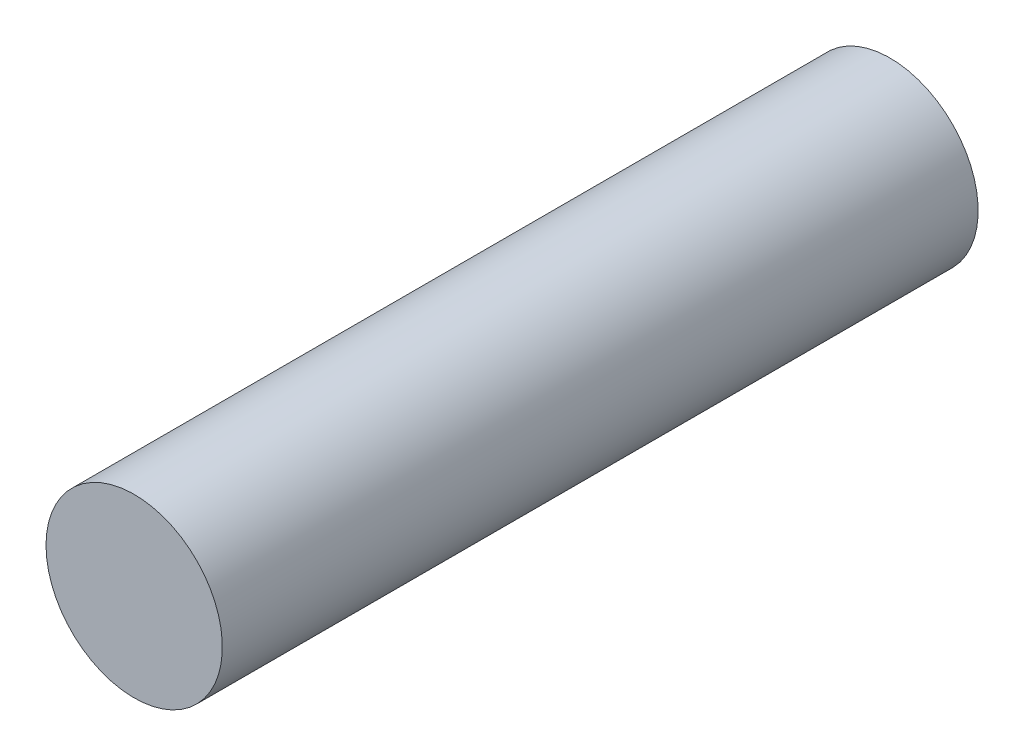
ISO-10303-21;
HEADER;
FILE_DESCRIPTION(('STEP AP214'),'2;1');
FILE_NAME('part.step','',(''),(''),'','','');
FILE_SCHEMA(('AUTOMOTIVE_DESIGN { 1 0 10303 214 1 1 1 1 }'));
ENDSEC;
DATA;
#1=APPLICATION_CONTEXT('core data for automotive mechanical design processes');
#2=APPLICATION_PROTOCOL_DEFINITION('international standard','automotive_design',2000,#1);
#3=PRODUCT_CONTEXT('',#1,'mechanical');
#4=PRODUCT('Part','Part','',(#3));
#5=PRODUCT_RELATED_PRODUCT_CATEGORY('part','',(#4));
#6=PRODUCT_DEFINITION_FORMATION('','',#4);
#7=PRODUCT_DEFINITION_CONTEXT('part definition',#1,'design');
#8=PRODUCT_DEFINITION('design','',#6,#7);
#9=PRODUCT_DEFINITION_SHAPE('','',#8);
#10=(LENGTH_UNIT() NAMED_UNIT(*) SI_UNIT(.MILLI.,.METRE.));
#11=(NAMED_UNIT(*) PLANE_ANGLE_UNIT() SI_UNIT($,.RADIAN.));
#12=(NAMED_UNIT(*) SI_UNIT($,.STERADIAN.) SOLID_ANGLE_UNIT());
#13=UNCERTAINTY_MEASURE_WITH_UNIT(LENGTH_MEASURE(1.E-05),#10,'distance_accuracy_value','');
#14=(GEOMETRIC_REPRESENTATION_CONTEXT(3) GLOBAL_UNCERTAINTY_ASSIGNED_CONTEXT((#13)) GLOBAL_UNIT_ASSIGNED_CONTEXT((#10,
#11,#12)) REPRESENTATION_CONTEXT('',''));
#15=CARTESIAN_POINT('',(0.,0.,0.));
#16=DIRECTION('',(0.,0.,1.));
#17=DIRECTION('',(1.,0.,0.));
#18=AXIS2_PLACEMENT_3D('',#15,#16,#17);
#19=CARTESIAN_POINT('',(2.5,0.,-20.));
#20=DIRECTION('',(0.,0.,-1.));
#21=DIRECTION('',(0.707106781186548,0.707106781186548,0.));
#22=AXIS2_PLACEMENT_3D('',#19,#20,#21);
#23=PLANE('',#22);
#24=CARTESIAN_POINT('',(0.,0.,-20.));
#25=DIRECTION('',(0.,0.,1.));
#26=DIRECTION('',(1.,0.,0.));
#27=AXIS2_PLACEMENT_3D('',#24,#25,#26);
#28=CIRCLE('',#27,1.75);
#29=CARTESIAN_POINT('',(-1.75,0.,-20.));
#30=VERTEX_POINT('',#29);
#31=EDGE_CURVE('E26',#30,#30,#28,.T.);
#32=ORIENTED_EDGE('',*,*,#31,.F.);
#33=EDGE_LOOP('',(#32));
#34=FACE_BOUND('',#33,.T.);
#35=ADVANCED_FACE('F17',(#34),#23,.T.);
#36=CARTESIAN_POINT('',(0.,0.,-5.));
#37=DIRECTION('',(0.,0.,1.));
#38=DIRECTION('',(0.707106781186548,0.707106781186548,0.));
#39=AXIS2_PLACEMENT_3D('',#36,#37,#38);
#40=PLANE('',#39);
#41=CARTESIAN_POINT('',(0.,0.,-5.));
#42=DIRECTION('',(0.,0.,1.));
#43=DIRECTION('',(1.,0.,0.));
#44=AXIS2_PLACEMENT_3D('',#41,#42,#43);
#45=CIRCLE('',#44,1.75);
#46=CARTESIAN_POINT('',(-1.75,0.,-5.));
#47=VERTEX_POINT('',#46);
#48=EDGE_CURVE('E11',#47,#47,#45,.T.);
#49=ORIENTED_EDGE('',*,*,#48,.T.);
#50=EDGE_LOOP('',(#49));
#51=FACE_BOUND('',#50,.T.);
#52=ADVANCED_FACE('F33',(#51),#40,.T.);
#53=CARTESIAN_POINT('',(0.,0.,-5.));
#54=DIRECTION('',(0.,0.,-1.));
#55=DIRECTION('',(1.,0.,0.));
#56=AXIS2_PLACEMENT_3D('',#53,#54,#55);
#57=CYLINDRICAL_SURFACE('',#56,1.75);
#58=ORIENTED_EDGE('',*,*,#31,.T.);
#59=EDGE_LOOP('',(#58));
#60=FACE_BOUND('',#59,.T.);
#61=ORIENTED_EDGE('',*,*,#48,.F.);
#62=EDGE_LOOP('',(#61));
#63=FACE_BOUND('',#62,.T.);
#64=ADVANCED_FACE('F19',(#60,#63),#57,.T.);
#65=CLOSED_SHELL('',(#35,#52,#64));
#66=MANIFOLD_SOLID_BREP('B1',#65);
#67=ADVANCED_BREP_SHAPE_REPRESENTATION('',(#18,#66),#14);
#68=SHAPE_DEFINITION_REPRESENTATION(#9,#67);
ENDSEC;
END-ISO-10303-21;
